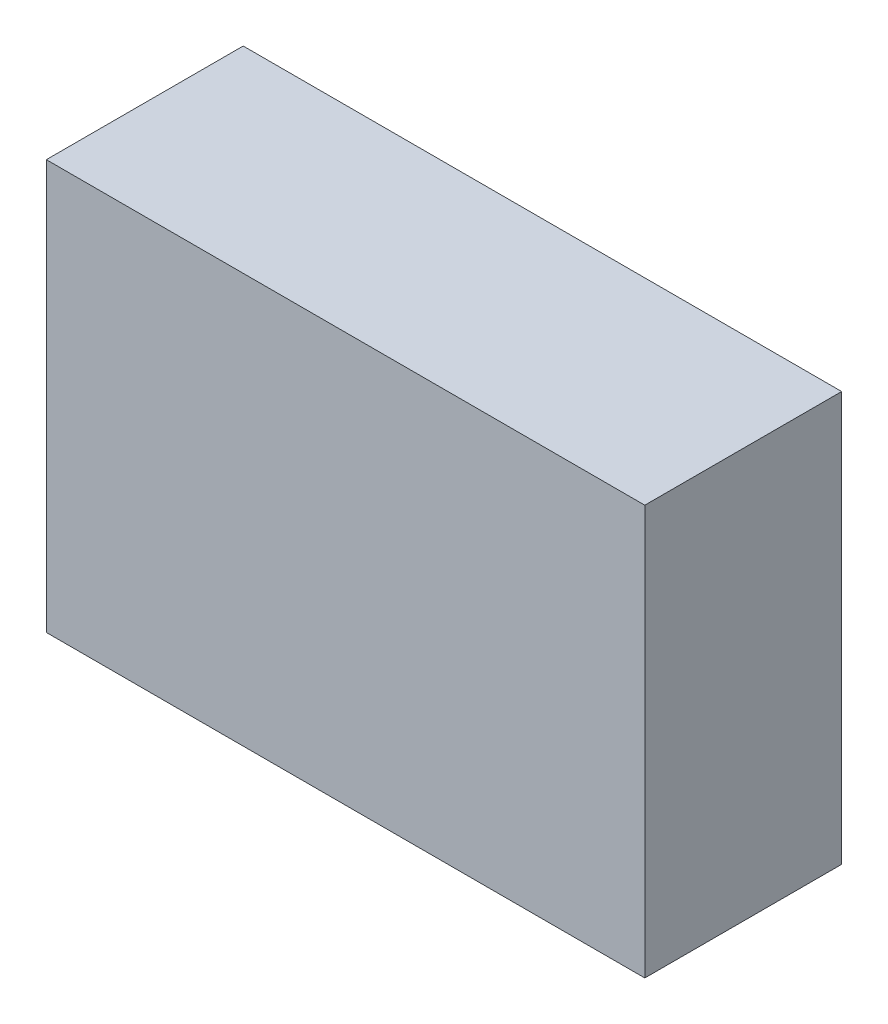
ISO-10303-21;
HEADER;
FILE_DESCRIPTION(('STEP AP214'),'2;1');
FILE_NAME('part.step','',(''),(''),'','','');
FILE_SCHEMA(('AUTOMOTIVE_DESIGN { 1 0 10303 214 1 1 1 1 }'));
ENDSEC;
DATA;
#1=APPLICATION_CONTEXT('core data for automotive mechanical design processes');
#2=APPLICATION_PROTOCOL_DEFINITION('international standard','automotive_design',2000,#1);
#3=PRODUCT_CONTEXT('',#1,'mechanical');
#4=PRODUCT('Part','Part','',(#3));
#5=PRODUCT_RELATED_PRODUCT_CATEGORY('part','',(#4));
#6=PRODUCT_DEFINITION_FORMATION('','',#4);
#7=PRODUCT_DEFINITION_CONTEXT('part definition',#1,'design');
#8=PRODUCT_DEFINITION('design','',#6,#7);
#9=PRODUCT_DEFINITION_SHAPE('','',#8);
#10=(LENGTH_UNIT() NAMED_UNIT(*) SI_UNIT(.MILLI.,.METRE.));
#11=(NAMED_UNIT(*) PLANE_ANGLE_UNIT() SI_UNIT($,.RADIAN.));
#12=(NAMED_UNIT(*) SI_UNIT($,.STERADIAN.) SOLID_ANGLE_UNIT());
#13=UNCERTAINTY_MEASURE_WITH_UNIT(LENGTH_MEASURE(1.E-05),#10,'distance_accuracy_value','');
#14=(GEOMETRIC_REPRESENTATION_CONTEXT(3) GLOBAL_UNCERTAINTY_ASSIGNED_CONTEXT((#13)) GLOBAL_UNIT_ASSIGNED_CONTEXT((#10,
#11,#12)) REPRESENTATION_CONTEXT('',''));
#15=CARTESIAN_POINT('',(0.,0.,0.));
#16=DIRECTION('',(0.,0.,1.));
#17=DIRECTION('',(1.,0.,0.));
#18=AXIS2_PLACEMENT_3D('',#15,#16,#17);
#19=CARTESIAN_POINT('',(0.,52.,25.));
#20=DIRECTION('',(1.,0.,0.));
#21=DIRECTION('',(0.,0.,-1.));
#22=AXIS2_PLACEMENT_3D('',#19,#20,#21);
#23=PLANE('',#22);
#24=DIRECTION('',(0.,-1.,0.));
#25=VECTOR('',#24,1.);
#26=CARTESIAN_POINT('',(0.,52.,0.));
#27=LINE('',#26,#25);
#28=CARTESIAN_POINT('',(0.,52.,0.));
#29=VERTEX_POINT('',#28);
#30=CARTESIAN_POINT('',(0.,0.,0.));
#31=VERTEX_POINT('',#30);
#32=EDGE_CURVE('E102',#29,#31,#27,.T.);
#33=ORIENTED_EDGE('',*,*,#32,.T.);
#34=DIRECTION('',(0.,0.,-1.));
#35=VECTOR('',#34,1.);
#36=CARTESIAN_POINT('',(0.,0.,25.));
#37=LINE('',#36,#35);
#38=CARTESIAN_POINT('',(0.,0.,25.));
#39=VERTEX_POINT('',#38);
#40=EDGE_CURVE('E11',#39,#31,#37,.T.);
#41=ORIENTED_EDGE('',*,*,#40,.F.);
#42=DIRECTION('',(0.,-1.,0.));
#43=VECTOR('',#42,1.);
#44=CARTESIAN_POINT('',(0.,52.,25.));
#45=LINE('',#44,#43);
#46=CARTESIAN_POINT('',(0.,52.,25.));
#47=VERTEX_POINT('',#46);
#48=EDGE_CURVE('E90',#47,#39,#45,.T.);
#49=ORIENTED_EDGE('',*,*,#48,.F.);
#50=DIRECTION('',(0.,0.,-1.));
#51=VECTOR('',#50,1.);
#52=CARTESIAN_POINT('',(0.,52.,25.));
#53=LINE('',#52,#51);
#54=EDGE_CURVE('E98',#47,#29,#53,.T.);
#55=ORIENTED_EDGE('',*,*,#54,.T.);
#56=EDGE_LOOP('',(#33,#41,#49,#55));
#57=FACE_BOUND('',#56,.T.);
#58=ADVANCED_FACE('F39',(#57),#23,.F.);
#59=CARTESIAN_POINT('',(0.,0.,25.));
#60=DIRECTION('',(0.,1.,0.));
#61=DIRECTION('',(0.,0.,1.));
#62=AXIS2_PLACEMENT_3D('',#59,#60,#61);
#63=PLANE('',#62);
#64=DIRECTION('',(1.,0.,0.));
#65=VECTOR('',#64,1.);
#66=CARTESIAN_POINT('',(0.,0.,0.));
#67=LINE('',#66,#65);
#68=CARTESIAN_POINT('',(76.,0.,0.));
#69=VERTEX_POINT('',#68);
#70=EDGE_CURVE('E94',#31,#69,#67,.T.);
#71=ORIENTED_EDGE('',*,*,#70,.T.);
#72=DIRECTION('',(0.,0.,-1.));
#73=VECTOR('',#72,1.);
#74=CARTESIAN_POINT('',(76.,0.,25.));
#75=LINE('',#74,#73);
#76=CARTESIAN_POINT('',(76.,0.,25.));
#77=VERTEX_POINT('',#76);
#78=EDGE_CURVE('E47',#77,#69,#75,.T.);
#79=ORIENTED_EDGE('',*,*,#78,.F.);
#80=DIRECTION('',(1.,0.,0.));
#81=VECTOR('',#80,1.);
#82=CARTESIAN_POINT('',(0.,0.,25.));
#83=LINE('',#82,#81);
#84=EDGE_CURVE('E85',#39,#77,#83,.T.);
#85=ORIENTED_EDGE('',*,*,#84,.F.);
#86=ORIENTED_EDGE('',*,*,#40,.T.);
#87=EDGE_LOOP('',(#71,#79,#85,#86));
#88=FACE_BOUND('',#87,.T.);
#89=ADVANCED_FACE('F93',(#88),#63,.F.);
#90=CARTESIAN_POINT('',(76.,0.,25.));
#91=DIRECTION('',(-1.,0.,0.));
#92=DIRECTION('',(0.,0.,1.));
#93=AXIS2_PLACEMENT_3D('',#90,#91,#92);
#94=PLANE('',#93);
#95=DIRECTION('',(0.,1.,0.));
#96=VECTOR('',#95,1.);
#97=CARTESIAN_POINT('',(76.,0.,0.));
#98=LINE('',#97,#96);
#99=CARTESIAN_POINT('',(76.,52.,0.));
#100=VERTEX_POINT('',#99);
#101=EDGE_CURVE('E72',#69,#100,#98,.T.);
#102=ORIENTED_EDGE('',*,*,#101,.T.);
#103=DIRECTION('',(0.,0.,-1.));
#104=VECTOR('',#103,1.);
#105=CARTESIAN_POINT('',(76.,52.,25.));
#106=LINE('',#105,#104);
#107=CARTESIAN_POINT('',(76.,52.,25.));
#108=VERTEX_POINT('',#107);
#109=EDGE_CURVE('E95',#108,#100,#106,.T.);
#110=ORIENTED_EDGE('',*,*,#109,.F.);
#111=DIRECTION('',(0.,1.,0.));
#112=VECTOR('',#111,1.);
#113=CARTESIAN_POINT('',(76.,0.,25.));
#114=LINE('',#113,#112);
#115=EDGE_CURVE('E88',#77,#108,#114,.T.);
#116=ORIENTED_EDGE('',*,*,#115,.F.);
#117=ORIENTED_EDGE('',*,*,#78,.T.);
#118=EDGE_LOOP('',(#102,#110,#116,#117));
#119=FACE_BOUND('',#118,.T.);
#120=ADVANCED_FACE('F96',(#119),#94,.F.);
#121=CARTESIAN_POINT('',(76.,52.,25.));
#122=DIRECTION('',(0.,-1.,0.));
#123=DIRECTION('',(0.,0.,-1.));
#124=AXIS2_PLACEMENT_3D('',#121,#122,#123);
#125=PLANE('',#124);
#126=DIRECTION('',(-1.,0.,0.));
#127=VECTOR('',#126,1.);
#128=CARTESIAN_POINT('',(76.,52.,0.));
#129=LINE('',#128,#127);
#130=EDGE_CURVE('E78',#100,#29,#129,.T.);
#131=ORIENTED_EDGE('',*,*,#130,.T.);
#132=ORIENTED_EDGE('',*,*,#54,.F.);
#133=DIRECTION('',(-1.,0.,0.));
#134=VECTOR('',#133,1.);
#135=CARTESIAN_POINT('',(76.,52.,25.));
#136=LINE('',#135,#134);
#137=EDGE_CURVE('E55',#108,#47,#136,.T.);
#138=ORIENTED_EDGE('',*,*,#137,.F.);
#139=ORIENTED_EDGE('',*,*,#109,.T.);
#140=EDGE_LOOP('',(#131,#132,#138,#139));
#141=FACE_BOUND('',#140,.T.);
#142=ADVANCED_FACE('F109',(#141),#125,.F.);
#143=CARTESIAN_POINT('',(0.,0.,25.));
#144=DIRECTION('',(0.,0.,1.));
#145=DIRECTION('',(1.,0.,0.));
#146=AXIS2_PLACEMENT_3D('',#143,#144,#145);
#147=PLANE('',#146);
#148=ORIENTED_EDGE('',*,*,#48,.T.);
#149=ORIENTED_EDGE('',*,*,#84,.T.);
#150=ORIENTED_EDGE('',*,*,#115,.T.);
#151=ORIENTED_EDGE('',*,*,#137,.T.);
#152=EDGE_LOOP('',(#148,#149,#150,#151));
#153=FACE_BOUND('',#152,.T.);
#154=ADVANCED_FACE('F86',(#153),#147,.T.);
#155=CARTESIAN_POINT('',(0.,0.,0.));
#156=DIRECTION('',(0.,0.,1.));
#157=DIRECTION('',(1.,0.,0.));
#158=AXIS2_PLACEMENT_3D('',#155,#156,#157);
#159=PLANE('',#158);
#160=ORIENTED_EDGE('',*,*,#32,.F.);
#161=ORIENTED_EDGE('',*,*,#130,.F.);
#162=ORIENTED_EDGE('',*,*,#101,.F.);
#163=ORIENTED_EDGE('',*,*,#70,.F.);
#164=EDGE_LOOP('',(#160,#161,#162,#163));
#165=FACE_BOUND('',#164,.T.);
#166=ADVANCED_FACE('F112',(#165),#159,.F.);
#167=CLOSED_SHELL('',(#58,#89,#120,#142,#154,#166));
#168=MANIFOLD_SOLID_BREP('B2',#167);
#169=ADVANCED_BREP_SHAPE_REPRESENTATION('',(#18,#168),#14);
#170=SHAPE_DEFINITION_REPRESENTATION(#9,#169);
ENDSEC;
END-ISO-10303-21;
